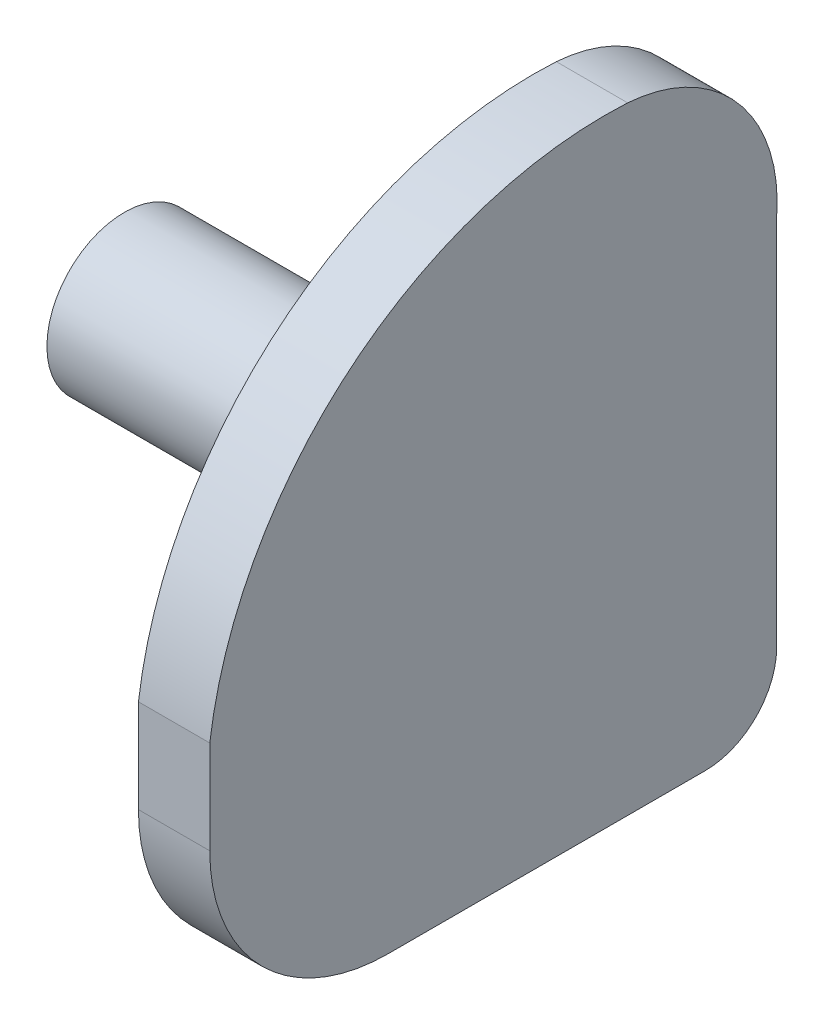
ISO-10303-21;
HEADER;
FILE_DESCRIPTION(('STEP AP214'),'2;1');
FILE_NAME('part.step','',(''),(''),'','','');
FILE_SCHEMA(('AUTOMOTIVE_DESIGN { 1 0 10303 214 1 1 1 1 }'));
ENDSEC;
DATA;
#1=APPLICATION_CONTEXT('core data for automotive mechanical design processes');
#2=APPLICATION_PROTOCOL_DEFINITION('international standard','automotive_design',2000,#1);
#3=PRODUCT_CONTEXT('',#1,'mechanical');
#4=PRODUCT('Part','Part','',(#3));
#5=PRODUCT_RELATED_PRODUCT_CATEGORY('part','',(#4));
#6=PRODUCT_DEFINITION_FORMATION('','',#4);
#7=PRODUCT_DEFINITION_CONTEXT('part definition',#1,'design');
#8=PRODUCT_DEFINITION('design','',#6,#7);
#9=PRODUCT_DEFINITION_SHAPE('','',#8);
#10=(LENGTH_UNIT() NAMED_UNIT(*) SI_UNIT(.MILLI.,.METRE.));
#11=(NAMED_UNIT(*) PLANE_ANGLE_UNIT() SI_UNIT($,.RADIAN.));
#12=(NAMED_UNIT(*) SI_UNIT($,.STERADIAN.) SOLID_ANGLE_UNIT());
#13=UNCERTAINTY_MEASURE_WITH_UNIT(LENGTH_MEASURE(1.E-05),#10,'distance_accuracy_value','');
#14=(GEOMETRIC_REPRESENTATION_CONTEXT(3) GLOBAL_UNCERTAINTY_ASSIGNED_CONTEXT((#13)) GLOBAL_UNIT_ASSIGNED_CONTEXT((#10,
#11,#12)) REPRESENTATION_CONTEXT('',''));
#15=CARTESIAN_POINT('',(0.,0.,0.));
#16=DIRECTION('',(0.,0.,1.));
#17=DIRECTION('',(1.,0.,0.));
#18=AXIS2_PLACEMENT_3D('',#15,#16,#17);
#19=CARTESIAN_POINT('',(11.10510806,-59.1327952518653,-81.4623727356959));
#20=DIRECTION('',(-1.,0.,0.));
#21=DIRECTION('',(0.,0.,1.));
#22=AXIS2_PLACEMENT_3D('',#19,#20,#21);
#23=CYLINDRICAL_SURFACE('',#22,5.5255403);
#24=CARTESIAN_POINT('',(8.89489194,-59.1327952518653,-81.4623727356959));
#25=DIRECTION('',(1.,0.,0.));
#26=DIRECTION('',(0.,0.,-1.));
#27=AXIS2_PLACEMENT_3D('',#24,#25,#26);
#28=CIRCLE('',#27,5.5255403);
#29=CARTESIAN_POINT('',(8.89489194,-59.1327952518653,-75.9368324356958));
#30=VERTEX_POINT('',#29);
#31=CARTESIAN_POINT('',(8.89489194,-64.6583355518653,-81.4623727356959));
#32=VERTEX_POINT('',#31);
#33=EDGE_CURVE('E136',#30,#32,#28,.T.);
#34=ORIENTED_EDGE('',*,*,#33,.T.);
#35=DIRECTION('',(-1.,0.,0.));
#36=VECTOR('',#35,1.);
#37=CARTESIAN_POINT('',(11.10510806,-64.6583355518653,-81.4623727356959));
#38=LINE('',#37,#36);
#39=CARTESIAN_POINT('',(11.10510806,-64.6583355518653,-81.4623727356959));
#40=VERTEX_POINT('',#39);
#41=EDGE_CURVE('E44',#40,#32,#38,.T.);
#42=ORIENTED_EDGE('',*,*,#41,.F.);
#43=CARTESIAN_POINT('',(11.10510806,-59.1327952518653,-81.4623727356959));
#44=DIRECTION('',(1.,0.,0.));
#45=DIRECTION('',(0.,0.,-1.));
#46=AXIS2_PLACEMENT_3D('',#43,#44,#45);
#47=CIRCLE('',#46,5.5255403);
#48=CARTESIAN_POINT('',(11.10510806,-59.1327952518653,-75.9368324356958));
#49=VERTEX_POINT('',#48);
#50=EDGE_CURVE('E158',#49,#40,#47,.T.);
#51=ORIENTED_EDGE('',*,*,#50,.F.);
#52=DIRECTION('',(-1.,0.,0.));
#53=VECTOR('',#52,1.);
#54=CARTESIAN_POINT('',(11.10510806,-59.1327952518653,-75.9368324356958));
#55=LINE('',#54,#53);
#56=EDGE_CURVE('E132',#49,#30,#55,.T.);
#57=ORIENTED_EDGE('',*,*,#56,.T.);
#58=EDGE_LOOP('',(#34,#42,#51,#57));
#59=FACE_BOUND('',#58,.T.);
#60=ADVANCED_FACE('F41',(#59),#23,.T.);
#61=CARTESIAN_POINT('',(11.10510806,-64.6583355518653,-82.4897959575849));
#62=DIRECTION('',(0.,1.,0.));
#63=DIRECTION('',(0.,0.,1.));
#64=AXIS2_PLACEMENT_3D('',#61,#62,#63);
#65=PLANE('',#64);
#66=DIRECTION('',(0.,0.,-1.));
#67=VECTOR('',#66,1.);
#68=CARTESIAN_POINT('',(8.89489194,-64.6583355518653,-82.4897959575849));
#69=LINE('',#68,#67);
#70=CARTESIAN_POINT('',(8.89489194,-64.6583355518653,-91.2910940169464));
#71=VERTEX_POINT('',#70);
#72=EDGE_CURVE('E140',#32,#71,#69,.T.);
#73=ORIENTED_EDGE('',*,*,#72,.T.);
#74=DIRECTION('',(-1.,0.,0.));
#75=VECTOR('',#74,1.);
#76=CARTESIAN_POINT('',(11.10510806,-64.6583355518653,-91.2910940169464));
#77=LINE('',#76,#75);
#78=CARTESIAN_POINT('',(11.10510806,-64.6583355518653,-91.2910940169464));
#79=VERTEX_POINT('',#78);
#80=EDGE_CURVE('E168',#79,#71,#77,.T.);
#81=ORIENTED_EDGE('',*,*,#80,.F.);
#82=DIRECTION('',(0.,0.,-1.));
#83=VECTOR('',#82,1.);
#84=CARTESIAN_POINT('',(11.10510806,-64.6583355518653,-81.4623727356959));
#85=LINE('',#84,#83);
#86=EDGE_CURVE('E96',#40,#79,#85,.T.);
#87=ORIENTED_EDGE('',*,*,#86,.F.);
#88=ORIENTED_EDGE('',*,*,#41,.T.);
#89=EDGE_LOOP('',(#73,#81,#87,#88));
#90=FACE_BOUND('',#89,.T.);
#91=ADVANCED_FACE('F176',(#90),#65,.F.);
#92=CARTESIAN_POINT('',(11.10510806,-62.4481194318653,-91.2910940169464));
#93=DIRECTION('',(-1.,0.,0.));
#94=DIRECTION('',(0.,0.,1.));
#95=AXIS2_PLACEMENT_3D('',#92,#93,#94);
#96=CYLINDRICAL_SURFACE('',#95,2.21021612);
#97=CARTESIAN_POINT('',(8.89489194,-62.4481194318653,-91.2910940169464));
#98=DIRECTION('',(1.,0.,0.));
#99=DIRECTION('',(0.,0.,-1.));
#100=AXIS2_PLACEMENT_3D('',#97,#98,#99);
#101=CIRCLE('',#100,2.21021612);
#102=CARTESIAN_POINT('',(8.89489194,-62.4481194318653,-93.5013101369464));
#103=VERTEX_POINT('',#102);
#104=EDGE_CURVE('E144',#71,#103,#101,.T.);
#105=ORIENTED_EDGE('',*,*,#104,.T.);
#106=DIRECTION('',(-1.,0.,0.));
#107=VECTOR('',#106,1.);
#108=CARTESIAN_POINT('',(11.10510806,-62.4481194318653,-93.5013101369464));
#109=LINE('',#108,#107);
#110=CARTESIAN_POINT('',(11.10510806,-62.4481194318653,-93.5013101369464));
#111=VERTEX_POINT('',#110);
#112=EDGE_CURVE('E165',#111,#103,#109,.T.);
#113=ORIENTED_EDGE('',*,*,#112,.F.);
#114=CARTESIAN_POINT('',(11.10510806,-62.4481194318653,-91.2910940169464));
#115=DIRECTION('',(1.,0.,0.));
#116=DIRECTION('',(0.,0.,-1.));
#117=AXIS2_PLACEMENT_3D('',#114,#115,#116);
#118=CIRCLE('',#117,2.21021612);
#119=EDGE_CURVE('E185',#79,#111,#118,.T.);
#120=ORIENTED_EDGE('',*,*,#119,.F.);
#121=ORIENTED_EDGE('',*,*,#80,.T.);
#122=EDGE_LOOP('',(#105,#113,#120,#121));
#123=FACE_BOUND('',#122,.T.);
#124=ADVANCED_FACE('F184',(#123),#96,.T.);
#125=CARTESIAN_POINT('',(11.10510806,-50.8771478566042,-93.5013101369464));
#126=DIRECTION('',(0.,0.,-1.));
#127=DIRECTION('',(-1.,0.,0.));
#128=AXIS2_PLACEMENT_3D('',#125,#126,#127);
#129=PLANE('',#128);
#130=DIRECTION('',(0.,-1.,0.));
#131=VECTOR('',#130,1.);
#132=CARTESIAN_POINT('',(8.89489194,-50.8771478566042,-93.5013101369464));
#133=LINE('',#132,#131);
#134=CARTESIAN_POINT('',(8.89489194,-50.8771478566042,-93.5013101369464));
#135=VERTEX_POINT('',#134);
#136=EDGE_CURVE('E148',#135,#103,#133,.T.);
#137=ORIENTED_EDGE('',*,*,#136,.F.);
#138=DIRECTION('',(-1.,0.,0.));
#139=VECTOR('',#138,1.);
#140=CARTESIAN_POINT('',(11.10510806,-50.8771478566042,-93.5013101369464));
#141=LINE('',#140,#139);
#142=CARTESIAN_POINT('',(11.10510806,-50.8771478566042,-93.5013101369464));
#143=VERTEX_POINT('',#142);
#144=EDGE_CURVE('E119',#143,#135,#141,.T.);
#145=ORIENTED_EDGE('',*,*,#144,.F.);
#146=DIRECTION('',(0.,-1.,0.));
#147=VECTOR('',#146,1.);
#148=CARTESIAN_POINT('',(11.10510806,-55.1339858609789,-93.5013101369464));
#149=LINE('',#148,#147);
#150=EDGE_CURVE('E124',#143,#111,#149,.T.);
#151=ORIENTED_EDGE('',*,*,#150,.T.);
#152=ORIENTED_EDGE('',*,*,#112,.T.);
#153=EDGE_LOOP('',(#137,#145,#151,#152));
#154=FACE_BOUND('',#153,.T.);
#155=ADVANCED_FACE('F187',(#154),#129,.T.);
#156=CARTESIAN_POINT('',(11.10510806,-50.5164284701532,-88.5231257206878));
#157=DIRECTION('',(-1.,0.,0.));
#158=DIRECTION('',(0.,0.,1.));
#159=AXIS2_PLACEMENT_3D('',#156,#157,#158);
#160=CYLINDRICAL_SURFACE('',#159,4.99123617534191);
#161=CARTESIAN_POINT('',(8.89489194,-50.5164284701532,-88.5231257206878));
#162=DIRECTION('',(-1.,0.,0.));
#163=DIRECTION('',(0.,0.,1.));
#164=AXIS2_PLACEMENT_3D('',#161,#162,#163);
#165=CIRCLE('',#164,4.99123617534191);
#166=CARTESIAN_POINT('',(8.89489194,-45.5382440549704,-88.8838451219861));
#167=VERTEX_POINT('',#166);
#168=EDGE_CURVE('E113',#167,#135,#165,.T.);
#169=ORIENTED_EDGE('',*,*,#168,.F.);
#170=DIRECTION('',(-1.,0.,0.));
#171=VECTOR('',#170,1.);
#172=CARTESIAN_POINT('',(11.10510806,-45.5382440549704,-88.8838451219861));
#173=LINE('',#172,#171);
#174=CARTESIAN_POINT('',(11.10510806,-45.5382440549704,-88.8838451219861));
#175=VERTEX_POINT('',#174);
#176=EDGE_CURVE('E108',#175,#167,#173,.T.);
#177=ORIENTED_EDGE('',*,*,#176,.F.);
#178=CARTESIAN_POINT('',(11.10510806,-50.5164284701532,-88.5231257206878));
#179=DIRECTION('',(-1.,0.,0.));
#180=DIRECTION('',(0.,0.,1.));
#181=AXIS2_PLACEMENT_3D('',#178,#179,#180);
#182=CIRCLE('',#181,4.99123617534191);
#183=EDGE_CURVE('E111',#175,#143,#182,.T.);
#184=ORIENTED_EDGE('',*,*,#183,.T.);
#185=ORIENTED_EDGE('',*,*,#144,.T.);
#186=EDGE_LOOP('',(#169,#177,#184,#185));
#187=FACE_BOUND('',#186,.T.);
#188=ADVANCED_FACE('F110',(#187),#160,.T.);
#189=CARTESIAN_POINT('',(11.10510806,-57.8809764135069,-88.1895585719001));
#190=DIRECTION('',(-1.,0.,0.));
#191=DIRECTION('',(0.,0.,1.));
#192=AXIS2_PLACEMENT_3D('',#189,#190,#191);
#193=CYLINDRICAL_SURFACE('',#192,12.3622439665335);
#194=CARTESIAN_POINT('',(8.89489194,-57.8809764135069,-88.1895585719001));
#195=DIRECTION('',(-1.,0.,0.));
#196=DIRECTION('',(0.,0.,1.));
#197=AXIS2_PLACEMENT_3D('',#194,#195,#196);
#198=CIRCLE('',#197,12.3622439665335);
#199=CARTESIAN_POINT('',(8.89489194,-56.239093920979,-75.9368324356958));
#200=VERTEX_POINT('',#199);
#201=EDGE_CURVE('E153',#200,#167,#198,.T.);
#202=ORIENTED_EDGE('',*,*,#201,.F.);
#203=DIRECTION('',(-1.,0.,0.));
#204=VECTOR('',#203,1.);
#205=CARTESIAN_POINT('',(11.10510806,-56.239093920979,-75.9368324356958));
#206=LINE('',#205,#204);
#207=CARTESIAN_POINT('',(11.10510806,-56.239093920979,-75.9368324356958));
#208=VERTEX_POINT('',#207);
#209=EDGE_CURVE('E84',#208,#200,#206,.T.);
#210=ORIENTED_EDGE('',*,*,#209,.F.);
#211=CARTESIAN_POINT('',(11.10510806,-57.8809764135069,-88.1895585719001));
#212=DIRECTION('',(-1.,0.,0.));
#213=DIRECTION('',(0.,0.,1.));
#214=AXIS2_PLACEMENT_3D('',#211,#212,#213);
#215=CIRCLE('',#214,12.3622439665335);
#216=EDGE_CURVE('E122',#208,#175,#215,.T.);
#217=ORIENTED_EDGE('',*,*,#216,.T.);
#218=ORIENTED_EDGE('',*,*,#176,.T.);
#219=EDGE_LOOP('',(#202,#210,#217,#218));
#220=FACE_BOUND('',#219,.T.);
#221=ADVANCED_FACE('F128',(#220),#193,.T.);
#222=CARTESIAN_POINT('',(11.10510806,-56.239093920979,-75.9368324356958));
#223=DIRECTION('',(0.,0.,-1.));
#224=DIRECTION('',(0.,1.,0.));
#225=AXIS2_PLACEMENT_3D('',#222,#223,#224);
#226=PLANE('',#225);
#227=DIRECTION('',(0.,-1.,0.));
#228=VECTOR('',#227,1.);
#229=CARTESIAN_POINT('',(8.89489194,-56.239093920979,-75.9368324356958));
#230=LINE('',#229,#228);
#231=EDGE_CURVE('E87',#200,#30,#230,.T.);
#232=ORIENTED_EDGE('',*,*,#231,.T.);
#233=ORIENTED_EDGE('',*,*,#56,.F.);
#234=DIRECTION('',(0.,-1.,0.));
#235=VECTOR('',#234,1.);
#236=CARTESIAN_POINT('',(11.10510806,-56.239093920979,-75.9368324356958));
#237=LINE('',#236,#235);
#238=EDGE_CURVE('E59',#208,#49,#237,.T.);
#239=ORIENTED_EDGE('',*,*,#238,.F.);
#240=ORIENTED_EDGE('',*,*,#209,.T.);
#241=EDGE_LOOP('',(#232,#233,#239,#240));
#242=FACE_BOUND('',#241,.T.);
#243=ADVANCED_FACE('F213',(#242),#226,.F.);
#244=CARTESIAN_POINT('',(11.10510806,-59.1327952518653,-81.4623727356959));
#245=DIRECTION('',(1.,0.,0.));
#246=DIRECTION('',(0.,0.,-1.));
#247=AXIS2_PLACEMENT_3D('',#244,#245,#246);
#248=PLANE('',#247);
#249=ORIENTED_EDGE('',*,*,#50,.T.);
#250=ORIENTED_EDGE('',*,*,#86,.T.);
#251=ORIENTED_EDGE('',*,*,#119,.T.);
#252=ORIENTED_EDGE('',*,*,#150,.F.);
#253=ORIENTED_EDGE('',*,*,#183,.F.);
#254=ORIENTED_EDGE('',*,*,#216,.F.);
#255=ORIENTED_EDGE('',*,*,#238,.T.);
#256=EDGE_LOOP('',(#249,#250,#251,#252,#253,#254,#255));
#257=FACE_BOUND('',#256,.T.);
#258=ADVANCED_FACE('F121',(#257),#248,.T.);
#259=CARTESIAN_POINT('',(8.89489194,-59.1327952518653,-81.4623727356959));
#260=DIRECTION('',(1.,0.,0.));
#261=DIRECTION('',(0.,0.,-1.));
#262=AXIS2_PLACEMENT_3D('',#259,#260,#261);
#263=PLANE('',#262);
#264=CARTESIAN_POINT('',(8.89489194,-55.2882440549704,-85.5013101369464));
#265=DIRECTION('',(-1.,0.,0.));
#266=DIRECTION('',(0.,0.,1.));
#267=AXIS2_PLACEMENT_3D('',#264,#265,#266);
#268=CIRCLE('',#267,2.4);
#269=CARTESIAN_POINT('',(8.89489194,-55.2882440549704,-83.1013101369464));
#270=VERTEX_POINT('',#269);
#271=EDGE_CURVE('E11',#270,#270,#268,.T.);
#272=ORIENTED_EDGE('',*,*,#271,.F.);
#273=EDGE_LOOP('',(#272));
#274=FACE_BOUND('',#273,.T.);
#275=ORIENTED_EDGE('',*,*,#33,.F.);
#276=ORIENTED_EDGE('',*,*,#231,.F.);
#277=ORIENTED_EDGE('',*,*,#201,.T.);
#278=ORIENTED_EDGE('',*,*,#168,.T.);
#279=ORIENTED_EDGE('',*,*,#136,.T.);
#280=ORIENTED_EDGE('',*,*,#104,.F.);
#281=ORIENTED_EDGE('',*,*,#72,.F.);
#282=EDGE_LOOP('',(#275,#276,#277,#278,#279,#280,#281));
#283=FACE_BOUND('',#282,.T.);
#284=ADVANCED_FACE('F181',(#274,#283),#263,.F.);
#285=CARTESIAN_POINT('',(-1.10510806,-55.2882440549704,-85.5013101369464));
#286=DIRECTION('',(1.,0.,0.));
#287=DIRECTION('',(0.,0.,-1.));
#288=AXIS2_PLACEMENT_3D('',#285,#286,#287);
#289=CYLINDRICAL_SURFACE('',#288,2.4);
#290=CARTESIAN_POINT('',(-1.10510806,-55.2882440549704,-85.5013101369464));
#291=DIRECTION('',(-1.,0.,0.));
#292=DIRECTION('',(0.,0.,1.));
#293=AXIS2_PLACEMENT_3D('',#290,#291,#292);
#294=CIRCLE('',#293,2.4);
#295=CARTESIAN_POINT('',(-1.10510806,-55.2882440549704,-83.1013101369464));
#296=VERTEX_POINT('',#295);
#297=EDGE_CURVE('E141',#296,#296,#294,.T.);
#298=ORIENTED_EDGE('',*,*,#297,.F.);
#299=EDGE_LOOP('',(#298));
#300=FACE_BOUND('',#299,.T.);
#301=ORIENTED_EDGE('',*,*,#271,.T.);
#302=EDGE_LOOP('',(#301));
#303=FACE_BOUND('',#302,.T.);
#304=ADVANCED_FACE('F202',(#300,#303),#289,.T.);
#305=CARTESIAN_POINT('',(-1.10510806,-55.2882440549704,-85.5013101369464));
#306=DIRECTION('',(-1.,0.,0.));
#307=DIRECTION('',(0.,0.,1.));
#308=AXIS2_PLACEMENT_3D('',#305,#306,#307);
#309=PLANE('',#308);
#310=ORIENTED_EDGE('',*,*,#297,.T.);
#311=EDGE_LOOP('',(#310));
#312=FACE_BOUND('',#311,.T.);
#313=ADVANCED_FACE('F200',(#312),#309,.T.);
#314=CLOSED_SHELL('',(#60,#91,#124,#155,#188,#221,#243,#258,#284,#304,#313));
#315=MANIFOLD_SOLID_BREP('B2',#314);
#316=ADVANCED_BREP_SHAPE_REPRESENTATION('',(#18,#315),#14);
#317=SHAPE_DEFINITION_REPRESENTATION(#9,#316);
ENDSEC;
END-ISO-10303-21;
